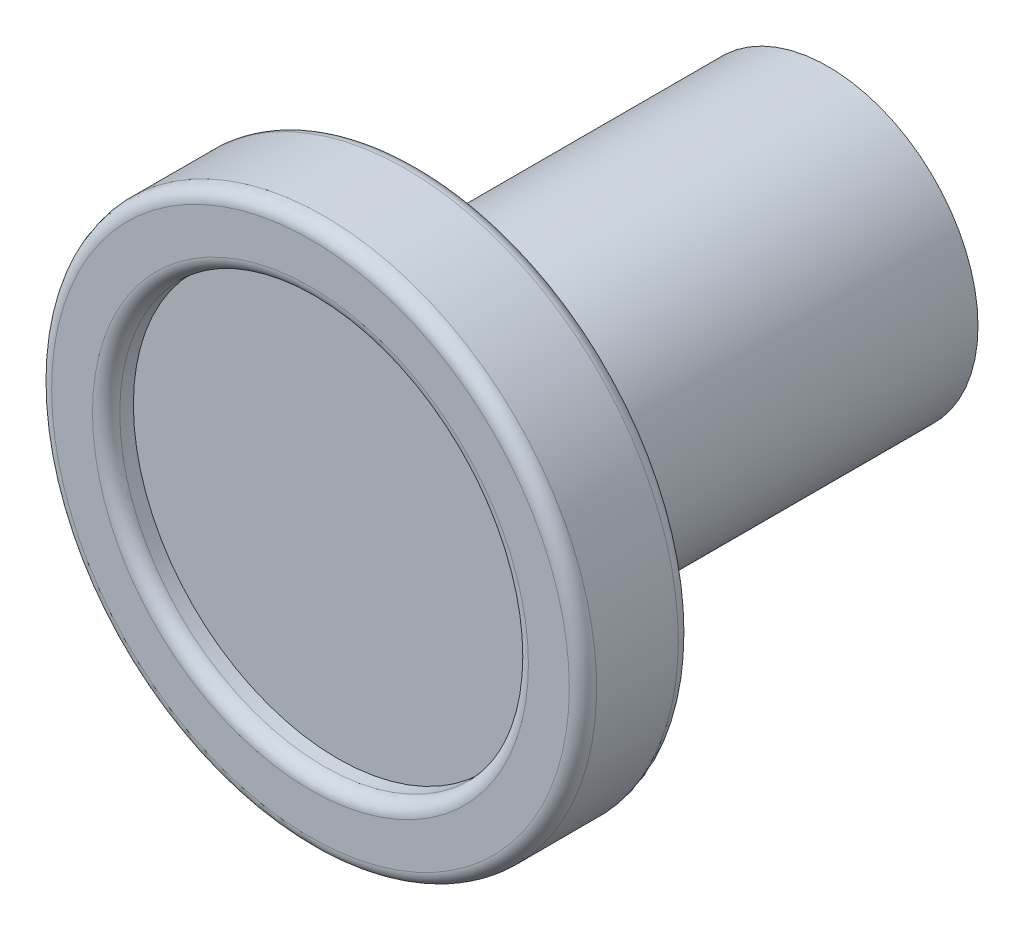
ISO-10303-21;
HEADER;
FILE_DESCRIPTION(('STEP AP214'),'2;1');
FILE_NAME('part.step','',(''),(''),'','','');
FILE_SCHEMA(('AUTOMOTIVE_DESIGN { 1 0 10303 214 1 1 1 1 }'));
ENDSEC;
DATA;
#1=APPLICATION_CONTEXT('core data for automotive mechanical design processes');
#2=APPLICATION_PROTOCOL_DEFINITION('international standard','automotive_design',2000,#1);
#3=PRODUCT_CONTEXT('',#1,'mechanical');
#4=PRODUCT('Part','Part','',(#3));
#5=PRODUCT_RELATED_PRODUCT_CATEGORY('part','',(#4));
#6=PRODUCT_DEFINITION_FORMATION('','',#4);
#7=PRODUCT_DEFINITION_CONTEXT('part definition',#1,'design');
#8=PRODUCT_DEFINITION('design','',#6,#7);
#9=PRODUCT_DEFINITION_SHAPE('','',#8);
#10=(LENGTH_UNIT() NAMED_UNIT(*) SI_UNIT(.MILLI.,.METRE.));
#11=(NAMED_UNIT(*) PLANE_ANGLE_UNIT() SI_UNIT($,.RADIAN.));
#12=(NAMED_UNIT(*) SI_UNIT($,.STERADIAN.) SOLID_ANGLE_UNIT());
#13=UNCERTAINTY_MEASURE_WITH_UNIT(LENGTH_MEASURE(1.E-05),#10,'distance_accuracy_value','');
#14=(GEOMETRIC_REPRESENTATION_CONTEXT(3) GLOBAL_UNCERTAINTY_ASSIGNED_CONTEXT((#13)) GLOBAL_UNIT_ASSIGNED_CONTEXT((#10,
#11,#12)) REPRESENTATION_CONTEXT('',''));
#15=CARTESIAN_POINT('',(0.,0.,0.));
#16=DIRECTION('',(0.,0.,1.));
#17=DIRECTION('',(1.,0.,0.));
#18=AXIS2_PLACEMENT_3D('',#15,#16,#17);
#19=CARTESIAN_POINT('',(0.,0.,36.));
#20=DIRECTION('',(0.,0.,1.));
#21=DIRECTION('',(1.,0.,0.));
#22=AXIS2_PLACEMENT_3D('',#19,#20,#21);
#23=PLANE('',#22);
#24=CARTESIAN_POINT('',(0.,0.,36.));
#25=DIRECTION('',(0.,0.,1.));
#26=DIRECTION('',(1.,0.,0.));
#27=AXIS2_PLACEMENT_3D('',#24,#25,#26);
#28=CIRCLE('',#27,15.);
#29=CARTESIAN_POINT('',(15.,0.,36.));
#30=VERTEX_POINT('',#29);
#31=EDGE_CURVE('E176',#30,#30,#28,.T.);
#32=ORIENTED_EDGE('',*,*,#31,.T.);
#33=EDGE_LOOP('',(#32));
#34=FACE_BOUND('',#33,.T.);
#35=ADVANCED_FACE('F16',(#34),#23,.T.);
#36=CARTESIAN_POINT('',(0.,0.,36.));
#37=DIRECTION('',(0.,0.,1.));
#38=DIRECTION('',(1.,0.,0.));
#39=AXIS2_PLACEMENT_3D('',#36,#37,#38);
#40=CYLINDRICAL_SURFACE('',#39,15.);
#41=ORIENTED_EDGE('',*,*,#31,.F.);
#42=EDGE_LOOP('',(#41));
#43=FACE_BOUND('',#42,.T.);
#44=CARTESIAN_POINT('',(0.,0.,37.));
#45=DIRECTION('',(0.,0.,1.));
#46=DIRECTION('',(1.,0.,0.));
#47=AXIS2_PLACEMENT_3D('',#44,#45,#46);
#48=CIRCLE('',#47,15.);
#49=CARTESIAN_POINT('',(15.,0.,37.));
#50=VERTEX_POINT('',#49);
#51=EDGE_CURVE('E62',#50,#50,#48,.F.);
#52=ORIENTED_EDGE('',*,*,#51,.F.);
#53=EDGE_LOOP('',(#52));
#54=FACE_BOUND('',#53,.T.);
#55=ADVANCED_FACE('F207',(#43,#54),#40,.F.);
#56=CARTESIAN_POINT('',(0.,0.,37.));
#57=DIRECTION('',(0.,0.,1.));
#58=DIRECTION('',(1.,0.,0.));
#59=AXIS2_PLACEMENT_3D('',#56,#57,#58);
#60=TOROIDAL_SURFACE('',#59,16.,1.);
#61=ORIENTED_EDGE('',*,*,#51,.T.);
#62=EDGE_LOOP('',(#61));
#63=FACE_BOUND('',#62,.T.);
#64=CARTESIAN_POINT('',(0.,0.,38.));
#65=DIRECTION('',(0.,0.,1.));
#66=DIRECTION('',(1.,0.,0.));
#67=AXIS2_PLACEMENT_3D('',#64,#65,#66);
#68=CIRCLE('',#67,16.);
#69=CARTESIAN_POINT('',(-16.,0.,38.));
#70=VERTEX_POINT('',#69);
#71=CARTESIAN_POINT('',(16.,0.,38.));
#72=VERTEX_POINT('',#71);
#73=EDGE_CURVE('E52',#70,#72,#68,.F.);
#74=ORIENTED_EDGE('',*,*,#73,.F.);
#75=CARTESIAN_POINT('',(0.,0.,38.));
#76=DIRECTION('',(0.,0.,1.));
#77=DIRECTION('',(-1.,0.,0.));
#78=AXIS2_PLACEMENT_3D('',#75,#76,#77);
#79=CIRCLE('',#78,16.);
#80=EDGE_CURVE('E50',#72,#70,#79,.F.);
#81=ORIENTED_EDGE('',*,*,#80,.F.);
#82=EDGE_LOOP('',(#74,#81));
#83=FACE_BOUND('',#82,.T.);
#84=ADVANCED_FACE('F54',(#63,#83),#60,.T.);
#85=CARTESIAN_POINT('',(0.,0.,38.));
#86=DIRECTION('',(0.,0.,1.));
#87=DIRECTION('',(1.,0.,0.));
#88=AXIS2_PLACEMENT_3D('',#85,#86,#87);
#89=PLANE('',#88);
#90=CARTESIAN_POINT('',(0.,0.,38.));
#91=DIRECTION('',(0.,0.,-1.));
#92=DIRECTION('',(-1.,0.,0.));
#93=AXIS2_PLACEMENT_3D('',#90,#91,#92);
#94=CIRCLE('',#93,19.);
#95=CARTESIAN_POINT('',(-19.,0.,38.));
#96=VERTEX_POINT('',#95);
#97=CARTESIAN_POINT('',(19.,0.,38.));
#98=VERTEX_POINT('',#97);
#99=EDGE_CURVE('E57',#96,#98,#94,.T.);
#100=ORIENTED_EDGE('',*,*,#99,.F.);
#101=CARTESIAN_POINT('',(0.,0.,38.));
#102=DIRECTION('',(0.,0.,-1.));
#103=DIRECTION('',(1.,0.,0.));
#104=AXIS2_PLACEMENT_3D('',#101,#102,#103);
#105=CIRCLE('',#104,19.);
#106=EDGE_CURVE('E102',#98,#96,#105,.T.);
#107=ORIENTED_EDGE('',*,*,#106,.F.);
#108=EDGE_LOOP('',(#100,#107));
#109=FACE_BOUND('',#108,.T.);
#110=ORIENTED_EDGE('',*,*,#80,.T.);
#111=ORIENTED_EDGE('',*,*,#73,.T.);
#112=EDGE_LOOP('',(#110,#111));
#113=FACE_BOUND('',#112,.T.);
#114=ADVANCED_FACE('F61',(#109,#113),#89,.T.);
#115=CARTESIAN_POINT('',(0.,0.,37.));
#116=DIRECTION('',(0.,0.,1.));
#117=DIRECTION('',(1.,0.,0.));
#118=AXIS2_PLACEMENT_3D('',#115,#116,#117);
#119=TOROIDAL_SURFACE('',#118,19.,1.);
#120=CARTESIAN_POINT('',(0.,0.,37.));
#121=DIRECTION('',(0.,0.,-1.));
#122=DIRECTION('',(-1.,0.,0.));
#123=AXIS2_PLACEMENT_3D('',#120,#121,#122);
#124=CIRCLE('',#123,20.);
#125=CARTESIAN_POINT('',(-20.,0.,37.));
#126=VERTEX_POINT('',#125);
#127=EDGE_CURVE('E122',#126,#126,#124,.T.);
#128=ORIENTED_EDGE('',*,*,#127,.F.);
#129=EDGE_LOOP('',(#128));
#130=FACE_BOUND('',#129,.T.);
#131=ORIENTED_EDGE('',*,*,#106,.T.);
#132=ORIENTED_EDGE('',*,*,#99,.T.);
#133=EDGE_LOOP('',(#131,#132));
#134=FACE_BOUND('',#133,.T.);
#135=ADVANCED_FACE('F79',(#130,#134),#119,.T.);
#136=CARTESIAN_POINT('',(0.,0.,38.));
#137=DIRECTION('',(0.,0.,-1.));
#138=DIRECTION('',(-1.,0.,0.));
#139=AXIS2_PLACEMENT_3D('',#136,#137,#138);
#140=CYLINDRICAL_SURFACE('',#139,20.);
#141=ORIENTED_EDGE('',*,*,#127,.T.);
#142=EDGE_LOOP('',(#141));
#143=FACE_BOUND('',#142,.T.);
#144=CARTESIAN_POINT('',(0.,0.,31.));
#145=DIRECTION('',(0.,0.,1.));
#146=DIRECTION('',(1.,0.,0.));
#147=AXIS2_PLACEMENT_3D('',#144,#145,#146);
#148=CIRCLE('',#147,20.);
#149=CARTESIAN_POINT('',(20.,0.,31.));
#150=VERTEX_POINT('',#149);
#151=EDGE_CURVE('E124',#150,#150,#148,.F.);
#152=ORIENTED_EDGE('',*,*,#151,.F.);
#153=EDGE_LOOP('',(#152));
#154=FACE_BOUND('',#153,.T.);
#155=ADVANCED_FACE('F145',(#143,#154),#140,.T.);
#156=CARTESIAN_POINT('',(0.,0.,31.));
#157=DIRECTION('',(0.,0.,1.));
#158=DIRECTION('',(1.,0.,0.));
#159=AXIS2_PLACEMENT_3D('',#156,#157,#158);
#160=TOROIDAL_SURFACE('',#159,19.,1.);
#161=CARTESIAN_POINT('',(0.,0.,30.));
#162=DIRECTION('',(0.,0.,1.));
#163=DIRECTION('',(1.,0.,0.));
#164=AXIS2_PLACEMENT_3D('',#161,#162,#163);
#165=CIRCLE('',#164,19.);
#166=CARTESIAN_POINT('',(19.,0.,30.));
#167=VERTEX_POINT('',#166);
#168=CARTESIAN_POINT('',(-19.,0.,30.));
#169=VERTEX_POINT('',#168);
#170=EDGE_CURVE('E35',#167,#169,#165,.T.);
#171=ORIENTED_EDGE('',*,*,#170,.T.);
#172=CARTESIAN_POINT('',(0.,0.,30.));
#173=DIRECTION('',(0.,0.,1.));
#174=DIRECTION('',(-1.,0.,0.));
#175=AXIS2_PLACEMENT_3D('',#172,#173,#174);
#176=CIRCLE('',#175,19.);
#177=EDGE_CURVE('E161',#169,#167,#176,.T.);
#178=ORIENTED_EDGE('',*,*,#177,.T.);
#179=EDGE_LOOP('',(#171,#178));
#180=FACE_BOUND('',#179,.T.);
#181=ORIENTED_EDGE('',*,*,#151,.T.);
#182=EDGE_LOOP('',(#181));
#183=FACE_BOUND('',#182,.T.);
#184=ADVANCED_FACE('F135',(#180,#183),#160,.T.);
#185=CARTESIAN_POINT('',(0.,0.,30.));
#186=DIRECTION('',(0.,0.,1.));
#187=DIRECTION('',(1.,0.,0.));
#188=AXIS2_PLACEMENT_3D('',#185,#186,#187);
#189=PLANE('',#188);
#190=CARTESIAN_POINT('',(0.,0.,30.));
#191=DIRECTION('',(0.,0.,-1.));
#192=DIRECTION('',(-1.,0.,0.));
#193=AXIS2_PLACEMENT_3D('',#190,#191,#192);
#194=CIRCLE('',#193,11.);
#195=CARTESIAN_POINT('',(-11.,0.,30.));
#196=VERTEX_POINT('',#195);
#197=EDGE_CURVE('E27',#196,#196,#194,.T.);
#198=ORIENTED_EDGE('',*,*,#197,.F.);
#199=EDGE_LOOP('',(#198));
#200=FACE_BOUND('',#199,.T.);
#201=ORIENTED_EDGE('',*,*,#170,.F.);
#202=ORIENTED_EDGE('',*,*,#177,.F.);
#203=EDGE_LOOP('',(#201,#202));
#204=FACE_BOUND('',#203,.T.);
#205=ADVANCED_FACE('F144',(#200,#204),#189,.F.);
#206=CARTESIAN_POINT('',(0.,0.,0.));
#207=DIRECTION('',(0.,0.,1.));
#208=DIRECTION('',(1.,0.,0.));
#209=AXIS2_PLACEMENT_3D('',#206,#207,#208);
#210=PLANE('',#209);
#211=CARTESIAN_POINT('',(0.,0.,0.));
#212=DIRECTION('',(0.,0.,-1.));
#213=DIRECTION('',(-1.,0.,0.));
#214=AXIS2_PLACEMENT_3D('',#211,#212,#213);
#215=CIRCLE('',#214,11.);
#216=CARTESIAN_POINT('',(-11.,0.,0.));
#217=VERTEX_POINT('',#216);
#218=EDGE_CURVE('E11',#217,#217,#215,.F.);
#219=ORIENTED_EDGE('',*,*,#218,.F.);
#220=EDGE_LOOP('',(#219));
#221=FACE_BOUND('',#220,.T.);
#222=ADVANCED_FACE('F217',(#221),#210,.F.);
#223=CARTESIAN_POINT('',(0.,0.,30.));
#224=DIRECTION('',(0.,0.,-1.));
#225=DIRECTION('',(-1.,0.,0.));
#226=AXIS2_PLACEMENT_3D('',#223,#224,#225);
#227=CYLINDRICAL_SURFACE('',#226,11.);
#228=ORIENTED_EDGE('',*,*,#218,.T.);
#229=EDGE_LOOP('',(#228));
#230=FACE_BOUND('',#229,.T.);
#231=ORIENTED_EDGE('',*,*,#197,.T.);
#232=EDGE_LOOP('',(#231));
#233=FACE_BOUND('',#232,.T.);
#234=ADVANCED_FACE('F215',(#230,#233),#227,.T.);
#235=CLOSED_SHELL('',(#35,#55,#84,#114,#135,#155,#184,#205,#222,#234));
#236=MANIFOLD_SOLID_BREP('B1',#235);
#237=ADVANCED_BREP_SHAPE_REPRESENTATION('',(#18,#236),#14);
#238=SHAPE_DEFINITION_REPRESENTATION(#9,#237);
ENDSEC;
END-ISO-10303-21;
